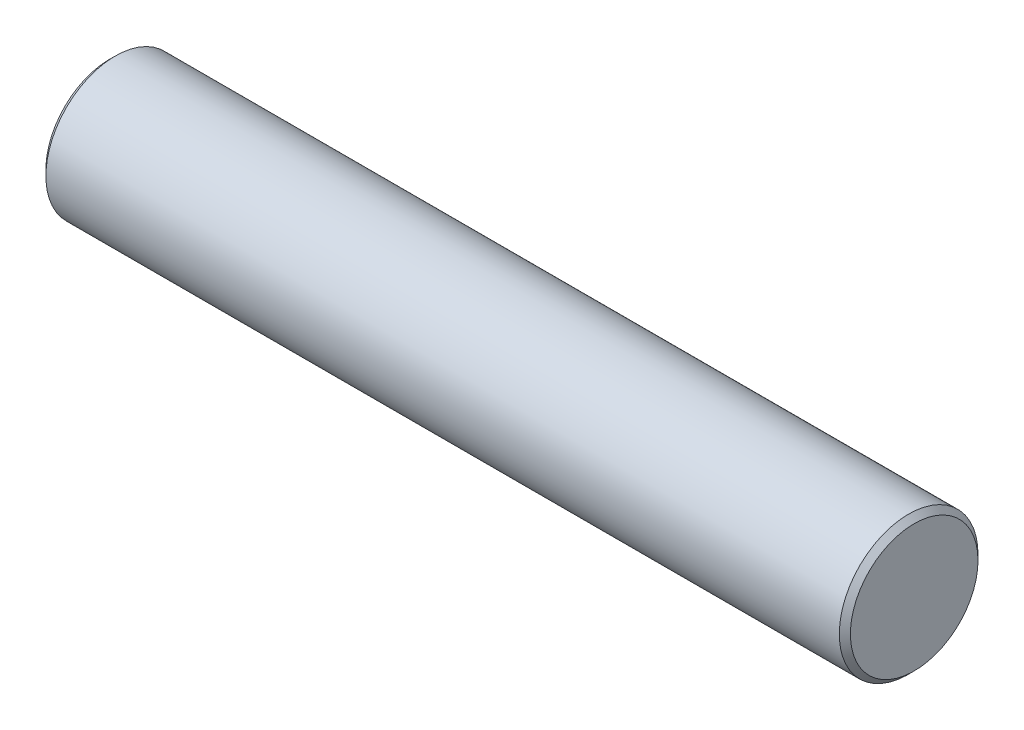
ISO-10303-21;
HEADER;
FILE_DESCRIPTION(('STEP AP214'),'2;1');
FILE_NAME('part.step','',(''),(''),'','','');
FILE_SCHEMA(('AUTOMOTIVE_DESIGN { 1 0 10303 214 1 1 1 1 }'));
ENDSEC;
DATA;
#1=APPLICATION_CONTEXT('core data for automotive mechanical design processes');
#2=APPLICATION_PROTOCOL_DEFINITION('international standard','automotive_design',2000,#1);
#3=PRODUCT_CONTEXT('',#1,'mechanical');
#4=PRODUCT('Part','Part','',(#3));
#5=PRODUCT_RELATED_PRODUCT_CATEGORY('part','',(#4));
#6=PRODUCT_DEFINITION_FORMATION('','',#4);
#7=PRODUCT_DEFINITION_CONTEXT('part definition',#1,'design');
#8=PRODUCT_DEFINITION('design','',#6,#7);
#9=PRODUCT_DEFINITION_SHAPE('','',#8);
#10=(LENGTH_UNIT() NAMED_UNIT(*) SI_UNIT(.MILLI.,.METRE.));
#11=(NAMED_UNIT(*) PLANE_ANGLE_UNIT() SI_UNIT($,.RADIAN.));
#12=(NAMED_UNIT(*) SI_UNIT($,.STERADIAN.) SOLID_ANGLE_UNIT());
#13=UNCERTAINTY_MEASURE_WITH_UNIT(LENGTH_MEASURE(1.E-05),#10,'distance_accuracy_value','');
#14=(GEOMETRIC_REPRESENTATION_CONTEXT(3) GLOBAL_UNCERTAINTY_ASSIGNED_CONTEXT((#13)) GLOBAL_UNIT_ASSIGNED_CONTEXT((#10,
#11,#12)) REPRESENTATION_CONTEXT('',''));
#15=CARTESIAN_POINT('',(0.,0.,0.));
#16=DIRECTION('',(0.,0.,1.));
#17=DIRECTION('',(1.,0.,0.));
#18=AXIS2_PLACEMENT_3D('',#15,#16,#17);
#19=CARTESIAN_POINT('',(145.,0.,0.));
#20=DIRECTION('',(-1.,0.,0.));
#21=DIRECTION('',(0.,0.,1.));
#22=AXIS2_PLACEMENT_3D('',#19,#20,#21);
#23=CYLINDRICAL_SURFACE('',#22,12.5);
#24=CARTESIAN_POINT('',(1.00000000000003,0.,0.));
#25=DIRECTION('',(1.,0.,0.));
#26=DIRECTION('',(0.,0.,-1.));
#27=AXIS2_PLACEMENT_3D('',#24,#25,#26);
#28=CIRCLE('',#27,12.5);
#29=CARTESIAN_POINT('',(1.00000000000003,0.,-12.5));
#30=VERTEX_POINT('',#29);
#31=EDGE_CURVE('E49',#30,#30,#28,.T.);
#32=ORIENTED_EDGE('',*,*,#31,.T.);
#33=EDGE_LOOP('',(#32));
#34=FACE_BOUND('',#33,.T.);
#35=CARTESIAN_POINT('',(144.,0.,0.));
#36=DIRECTION('',(1.,0.,0.));
#37=DIRECTION('',(0.,0.,-1.));
#38=AXIS2_PLACEMENT_3D('',#35,#36,#37);
#39=CIRCLE('',#38,12.5);
#40=CARTESIAN_POINT('',(144.,0.,-12.5));
#41=VERTEX_POINT('',#40);
#42=EDGE_CURVE('E53',#41,#41,#39,.F.);
#43=ORIENTED_EDGE('',*,*,#42,.T.);
#44=EDGE_LOOP('',(#43));
#45=FACE_BOUND('',#44,.T.);
#46=ADVANCED_FACE('F37',(#34,#45),#23,.T.);
#47=CARTESIAN_POINT('',(145.,0.,0.));
#48=DIRECTION('',(1.,0.,0.));
#49=DIRECTION('',(0.,0.,-1.));
#50=AXIS2_PLACEMENT_3D('',#47,#48,#49);
#51=PLANE('',#50);
#52=CARTESIAN_POINT('',(145.,0.,0.));
#53=DIRECTION('',(1.,0.,0.));
#54=DIRECTION('',(0.,0.,-1.));
#55=AXIS2_PLACEMENT_3D('',#52,#53,#54);
#56=CIRCLE('',#55,11.5);
#57=CARTESIAN_POINT('',(145.,0.,-11.5));
#58=VERTEX_POINT('',#57);
#59=EDGE_CURVE('E10',#58,#58,#56,.T.);
#60=ORIENTED_EDGE('',*,*,#59,.T.);
#61=EDGE_LOOP('',(#60));
#62=FACE_BOUND('',#61,.T.);
#63=ADVANCED_FACE('F69',(#62),#51,.T.);
#64=CARTESIAN_POINT('',(0.,0.,0.));
#65=DIRECTION('',(1.,0.,0.));
#66=DIRECTION('',(0.,0.,-1.));
#67=AXIS2_PLACEMENT_3D('',#64,#65,#66);
#68=PLANE('',#67);
#69=CARTESIAN_POINT('',(0.,0.,0.));
#70=DIRECTION('',(1.,0.,0.));
#71=DIRECTION('',(0.,0.,-1.));
#72=AXIS2_PLACEMENT_3D('',#69,#70,#71);
#73=CIRCLE('',#72,11.5);
#74=CARTESIAN_POINT('',(0.,0.,-11.5));
#75=VERTEX_POINT('',#74);
#76=EDGE_CURVE('E45',#75,#75,#73,.F.);
#77=ORIENTED_EDGE('',*,*,#76,.T.);
#78=EDGE_LOOP('',(#77));
#79=FACE_BOUND('',#78,.T.);
#80=ADVANCED_FACE('F66',(#79),#68,.F.);
#81=CARTESIAN_POINT('',(1.00000000000003,0.,0.));
#82=DIRECTION('',(1.,0.,0.));
#83=DIRECTION('',(0.,0.,-1.));
#84=AXIS2_PLACEMENT_3D('',#81,#82,#83);
#85=CONICAL_SURFACE('',#84,12.5,0.785398163397443);
#86=ORIENTED_EDGE('',*,*,#76,.F.);
#87=EDGE_LOOP('',(#86));
#88=FACE_BOUND('',#87,.T.);
#89=ORIENTED_EDGE('',*,*,#31,.F.);
#90=EDGE_LOOP('',(#89));
#91=FACE_BOUND('',#90,.T.);
#92=ADVANCED_FACE('F62',(#88,#91),#85,.T.);
#93=CARTESIAN_POINT('',(145.,0.,0.));
#94=DIRECTION('',(-1.,0.,0.));
#95=DIRECTION('',(0.,0.,1.));
#96=AXIS2_PLACEMENT_3D('',#93,#94,#95);
#97=CONICAL_SURFACE('',#96,11.5,0.785398163397443);
#98=ORIENTED_EDGE('',*,*,#42,.F.);
#99=EDGE_LOOP('',(#98));
#100=FACE_BOUND('',#99,.T.);
#101=ORIENTED_EDGE('',*,*,#59,.F.);
#102=EDGE_LOOP('',(#101));
#103=FACE_BOUND('',#102,.T.);
#104=ADVANCED_FACE('F40',(#100,#103),#97,.T.);
#105=CLOSED_SHELL('',(#46,#63,#80,#92,#104));
#106=MANIFOLD_SOLID_BREP('B2',#105);
#107=ADVANCED_BREP_SHAPE_REPRESENTATION('',(#18,#106),#14);
#108=SHAPE_DEFINITION_REPRESENTATION(#9,#107);
ENDSEC;
END-ISO-10303-21;
